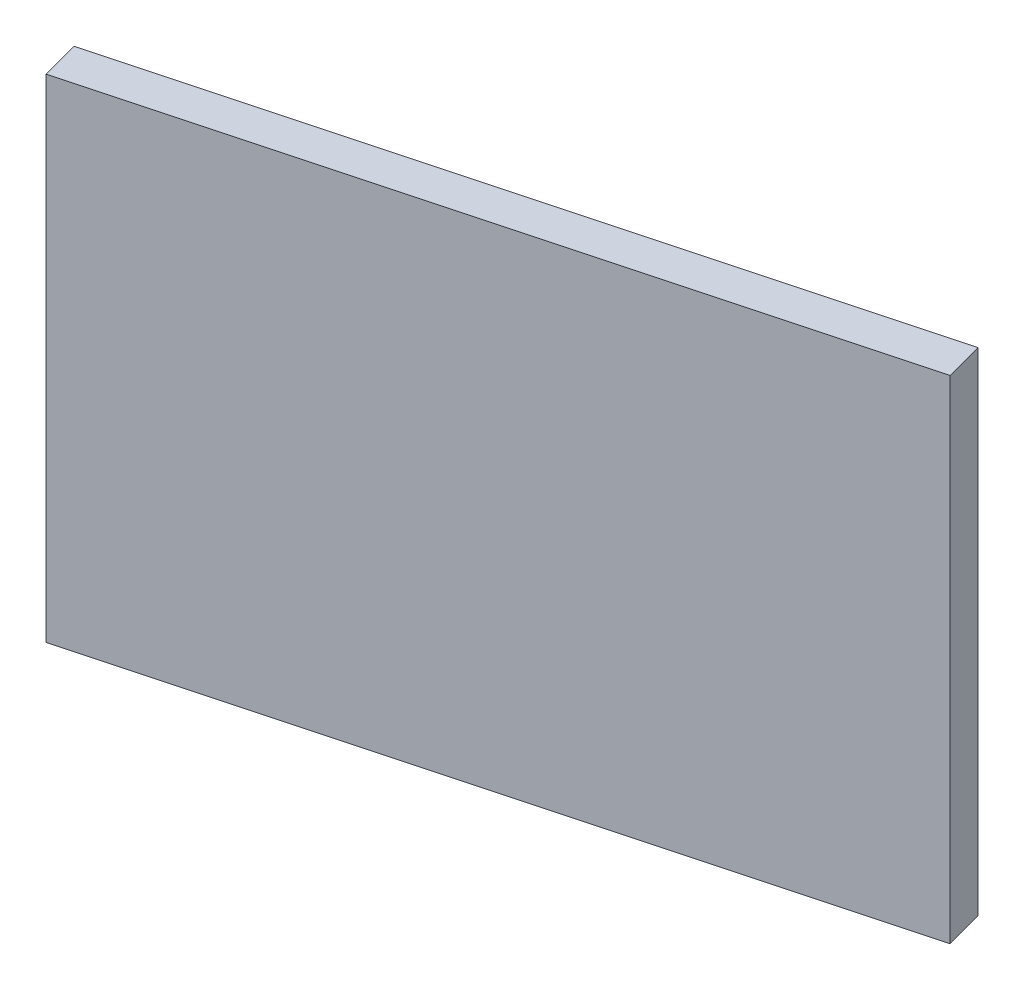
ISO-10303-21;
HEADER;
FILE_DESCRIPTION(('STEP AP214'),'2;1');
FILE_NAME('part.step','',(''),(''),'','','');
FILE_SCHEMA(('AUTOMOTIVE_DESIGN { 1 0 10303 214 1 1 1 1 }'));
ENDSEC;
DATA;
#1=APPLICATION_CONTEXT('core data for automotive mechanical design processes');
#2=APPLICATION_PROTOCOL_DEFINITION('international standard','automotive_design',2000,#1);
#3=PRODUCT_CONTEXT('',#1,'mechanical');
#4=PRODUCT('Part','Part','',(#3));
#5=PRODUCT_RELATED_PRODUCT_CATEGORY('part','',(#4));
#6=PRODUCT_DEFINITION_FORMATION('','',#4);
#7=PRODUCT_DEFINITION_CONTEXT('part definition',#1,'design');
#8=PRODUCT_DEFINITION('design','',#6,#7);
#9=PRODUCT_DEFINITION_SHAPE('','',#8);
#10=(LENGTH_UNIT() NAMED_UNIT(*) SI_UNIT(.MILLI.,.METRE.));
#11=(NAMED_UNIT(*) PLANE_ANGLE_UNIT() SI_UNIT($,.RADIAN.));
#12=(NAMED_UNIT(*) SI_UNIT($,.STERADIAN.) SOLID_ANGLE_UNIT());
#13=UNCERTAINTY_MEASURE_WITH_UNIT(LENGTH_MEASURE(1.E-05),#10,'distance_accuracy_value','');
#14=(GEOMETRIC_REPRESENTATION_CONTEXT(3) GLOBAL_UNCERTAINTY_ASSIGNED_CONTEXT((#13)) GLOBAL_UNIT_ASSIGNED_CONTEXT((#10,
#11,#12)) REPRESENTATION_CONTEXT('',''));
#15=CARTESIAN_POINT('',(0.,0.,0.));
#16=DIRECTION('',(0.,0.,1.));
#17=DIRECTION('',(1.,0.,0.));
#18=AXIS2_PLACEMENT_3D('',#15,#16,#17);
#19=CARTESIAN_POINT('',(-72.44443697168,1950.,2587.693637826));
#20=DIRECTION('',(0.258819045102985,0.,0.965925826288944));
#21=DIRECTION('',(0.,-1.,0.));
#22=AXIS2_PLACEMENT_3D('',#19,#20,#21);
#23=PLANE('',#22);
#24=DIRECTION('',(0.,1.,0.));
#25=VECTOR('',#24,1.);
#26=CARTESIAN_POINT('',(-72.44443697168,1950.,2587.693637826));
#27=LINE('',#26,#25);
#28=CARTESIAN_POINT('',(-72.44443697168,1950.,2587.693637826));
#29=VERTEX_POINT('',#28);
#30=CARTESIAN_POINT('',(-72.44443697168,2050.,2587.693637826));
#31=VERTEX_POINT('',#30);
#32=EDGE_CURVE('E89',#29,#31,#27,.T.);
#33=ORIENTED_EDGE('',*,*,#32,.F.);
#34=DIRECTION('',(0.965925826288944,0.,-0.258819045102985));
#35=VECTOR('',#34,1.);
#36=CARTESIAN_POINT('',(-72.44443697168,1950.,2587.693637826));
#37=LINE('',#36,#35);
#38=CARTESIAN_POINT('',(72.44443697168,1950.,2548.870781061));
#39=VERTEX_POINT('',#38);
#40=EDGE_CURVE('E72',#29,#39,#37,.T.);
#41=ORIENTED_EDGE('',*,*,#40,.T.);
#42=DIRECTION('',(0.,1.,0.));
#43=VECTOR('',#42,1.);
#44=CARTESIAN_POINT('',(72.44443697168,1950.,2548.870781061));
#45=LINE('',#44,#43);
#46=CARTESIAN_POINT('',(72.44443697168,2050.,2548.870781061));
#47=VERTEX_POINT('',#46);
#48=EDGE_CURVE('E84',#39,#47,#45,.T.);
#49=ORIENTED_EDGE('',*,*,#48,.T.);
#50=DIRECTION('',(0.965925826288944,0.,-0.258819045102985));
#51=VECTOR('',#50,1.);
#52=CARTESIAN_POINT('',(-72.44443697168,2050.,2587.693637826));
#53=LINE('',#52,#51);
#54=EDGE_CURVE('E11',#31,#47,#53,.T.);
#55=ORIENTED_EDGE('',*,*,#54,.F.);
#56=EDGE_LOOP('',(#33,#41,#49,#55));
#57=FACE_BOUND('',#56,.T.);
#58=ADVANCED_FACE('F17',(#57),#23,.T.);
#59=CARTESIAN_POINT('',(-74.5149893325,1950.,2579.966231216));
#60=DIRECTION('',(0.258819045102985,0.,0.965925826288944));
#61=DIRECTION('',(0.,-1.,0.));
#62=AXIS2_PLACEMENT_3D('',#59,#60,#61);
#63=PLANE('',#62);
#64=DIRECTION('',(0.965925826288944,0.,-0.258819045102985));
#65=VECTOR('',#64,1.);
#66=CARTESIAN_POINT('',(-74.5149893325,2050.,2579.966231216));
#67=LINE('',#66,#65);
#68=CARTESIAN_POINT('',(-74.5149893325,2050.,2579.966231216));
#69=VERTEX_POINT('',#68);
#70=CARTESIAN_POINT('',(70.37388461086,2050.,2541.14337445));
#71=VERTEX_POINT('',#70);
#72=EDGE_CURVE('E21',#69,#71,#67,.T.);
#73=ORIENTED_EDGE('',*,*,#72,.T.);
#74=DIRECTION('',(0.,1.,0.));
#75=VECTOR('',#74,1.);
#76=CARTESIAN_POINT('',(70.37388461086,1950.,2541.14337445));
#77=LINE('',#76,#75);
#78=CARTESIAN_POINT('',(70.37388461086,1950.,2541.14337445));
#79=VERTEX_POINT('',#78);
#80=EDGE_CURVE('E106',#79,#71,#77,.T.);
#81=ORIENTED_EDGE('',*,*,#80,.F.);
#82=DIRECTION('',(0.965925826288944,0.,-0.258819045102985));
#83=VECTOR('',#82,1.);
#84=CARTESIAN_POINT('',(-74.5149893325,1950.,2579.966231216));
#85=LINE('',#84,#83);
#86=CARTESIAN_POINT('',(-74.5149893325,1950.,2579.966231216));
#87=VERTEX_POINT('',#86);
#88=EDGE_CURVE('E83',#87,#79,#85,.T.);
#89=ORIENTED_EDGE('',*,*,#88,.F.);
#90=DIRECTION('',(0.,1.,0.));
#91=VECTOR('',#90,1.);
#92=CARTESIAN_POINT('',(-74.5149893325,1950.,2579.966231216));
#93=LINE('',#92,#91);
#94=EDGE_CURVE('E90',#87,#69,#93,.T.);
#95=ORIENTED_EDGE('',*,*,#94,.T.);
#96=EDGE_LOOP('',(#73,#81,#89,#95));
#97=FACE_BOUND('',#96,.T.);
#98=ADVANCED_FACE('F119',(#97),#63,.F.);
#99=CARTESIAN_POINT('',(-74.5149893325,2050.,2579.966231216));
#100=DIRECTION('',(0.,1.,0.));
#101=DIRECTION('',(1.,0.,0.));
#102=AXIS2_PLACEMENT_3D('',#99,#100,#101);
#103=PLANE('',#102);
#104=ORIENTED_EDGE('',*,*,#72,.F.);
#105=DIRECTION('',(0.258819045102985,0.,0.965925826288944));
#106=VECTOR('',#105,1.);
#107=CARTESIAN_POINT('',(-74.5149893325,2050.,2579.966231216));
#108=LINE('',#107,#106);
#109=EDGE_CURVE('E94',#69,#31,#108,.T.);
#110=ORIENTED_EDGE('',*,*,#109,.T.);
#111=ORIENTED_EDGE('',*,*,#54,.T.);
#112=DIRECTION('',(0.258819045102985,0.,0.965925826288944));
#113=VECTOR('',#112,1.);
#114=CARTESIAN_POINT('',(70.37388461086,2050.,2541.14337445));
#115=LINE('',#114,#113);
#116=EDGE_CURVE('E112',#71,#47,#115,.T.);
#117=ORIENTED_EDGE('',*,*,#116,.F.);
#118=EDGE_LOOP('',(#104,#110,#111,#117));
#119=FACE_BOUND('',#118,.T.);
#120=ADVANCED_FACE('F19',(#119),#103,.T.);
#121=CARTESIAN_POINT('',(-74.5149893325,1950.,2579.966231216));
#122=DIRECTION('',(0.,1.,0.));
#123=DIRECTION('',(1.,0.,0.));
#124=AXIS2_PLACEMENT_3D('',#121,#122,#123);
#125=PLANE('',#124);
#126=DIRECTION('',(0.258819045102985,0.,0.965925826288944));
#127=VECTOR('',#126,1.);
#128=CARTESIAN_POINT('',(70.37388461086,1950.,2541.14337445));
#129=LINE('',#128,#127);
#130=EDGE_CURVE('E78',#79,#39,#129,.T.);
#131=ORIENTED_EDGE('',*,*,#130,.T.);
#132=ORIENTED_EDGE('',*,*,#40,.F.);
#133=DIRECTION('',(0.258819045102985,0.,0.965925826288944));
#134=VECTOR('',#133,1.);
#135=CARTESIAN_POINT('',(-74.5149893325,1950.,2579.966231216));
#136=LINE('',#135,#134);
#137=EDGE_CURVE('E75',#87,#29,#136,.T.);
#138=ORIENTED_EDGE('',*,*,#137,.F.);
#139=ORIENTED_EDGE('',*,*,#88,.T.);
#140=EDGE_LOOP('',(#131,#132,#138,#139));
#141=FACE_BOUND('',#140,.T.);
#142=ADVANCED_FACE('F74',(#141),#125,.F.);
#143=CARTESIAN_POINT('',(70.37388461086,1950.,2541.14337445));
#144=DIRECTION('',(0.965925826288944,0.,-0.258819045102985));
#145=DIRECTION('',(0.,-1.,0.));
#146=AXIS2_PLACEMENT_3D('',#143,#144,#145);
#147=PLANE('',#146);
#148=ORIENTED_EDGE('',*,*,#130,.F.);
#149=ORIENTED_EDGE('',*,*,#80,.T.);
#150=ORIENTED_EDGE('',*,*,#116,.T.);
#151=ORIENTED_EDGE('',*,*,#48,.F.);
#152=EDGE_LOOP('',(#148,#149,#150,#151));
#153=FACE_BOUND('',#152,.T.);
#154=ADVANCED_FACE('F118',(#153),#147,.T.);
#155=CARTESIAN_POINT('',(-74.5149893325,1950.,2579.966231216));
#156=DIRECTION('',(0.965925826288944,0.,-0.258819045102985));
#157=DIRECTION('',(0.,-1.,0.));
#158=AXIS2_PLACEMENT_3D('',#155,#156,#157);
#159=PLANE('',#158);
#160=ORIENTED_EDGE('',*,*,#32,.T.);
#161=ORIENTED_EDGE('',*,*,#109,.F.);
#162=ORIENTED_EDGE('',*,*,#94,.F.);
#163=ORIENTED_EDGE('',*,*,#137,.T.);
#164=EDGE_LOOP('',(#160,#161,#162,#163));
#165=FACE_BOUND('',#164,.T.);
#166=ADVANCED_FACE('F87',(#165),#159,.F.);
#167=CLOSED_SHELL('',(#58,#98,#120,#142,#154,#166));
#168=MANIFOLD_SOLID_BREP('B1',#167);
#169=ADVANCED_BREP_SHAPE_REPRESENTATION('',(#18,#168),#14);
#170=SHAPE_DEFINITION_REPRESENTATION(#9,#169);
ENDSEC;
END-ISO-10303-21;
